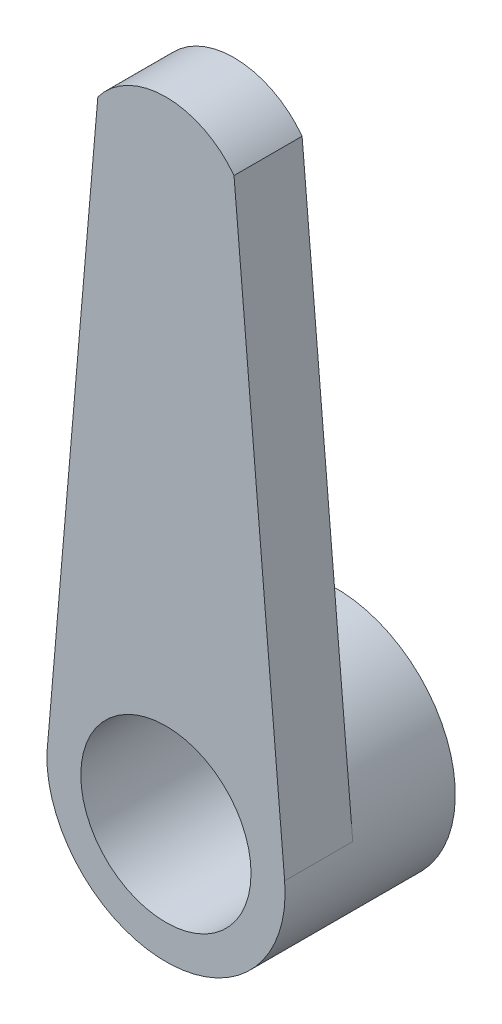
ISO-10303-21;
HEADER;
FILE_DESCRIPTION(('STEP AP214'),'2;1');
FILE_NAME('part.step','',(''),(''),'','','');
FILE_SCHEMA(('AUTOMOTIVE_DESIGN { 1 0 10303 214 1 1 1 1 }'));
ENDSEC;
DATA;
#1=APPLICATION_CONTEXT('core data for automotive mechanical design processes');
#2=APPLICATION_PROTOCOL_DEFINITION('international standard','automotive_design',2000,#1);
#3=PRODUCT_CONTEXT('',#1,'mechanical');
#4=PRODUCT('Part','Part','',(#3));
#5=PRODUCT_RELATED_PRODUCT_CATEGORY('part','',(#4));
#6=PRODUCT_DEFINITION_FORMATION('','',#4);
#7=PRODUCT_DEFINITION_CONTEXT('part definition',#1,'design');
#8=PRODUCT_DEFINITION('design','',#6,#7);
#9=PRODUCT_DEFINITION_SHAPE('','',#8);
#10=(LENGTH_UNIT() NAMED_UNIT(*) SI_UNIT(.MILLI.,.METRE.));
#11=(NAMED_UNIT(*) PLANE_ANGLE_UNIT() SI_UNIT($,.RADIAN.));
#12=(NAMED_UNIT(*) SI_UNIT($,.STERADIAN.) SOLID_ANGLE_UNIT());
#13=UNCERTAINTY_MEASURE_WITH_UNIT(LENGTH_MEASURE(1.E-05),#10,'distance_accuracy_value','');
#14=(GEOMETRIC_REPRESENTATION_CONTEXT(3) GLOBAL_UNCERTAINTY_ASSIGNED_CONTEXT((#13)) GLOBAL_UNIT_ASSIGNED_CONTEXT((#10,
#11,#12)) REPRESENTATION_CONTEXT('',''));
#15=CARTESIAN_POINT('',(0.,0.,0.));
#16=DIRECTION('',(0.,0.,1.));
#17=DIRECTION('',(1.,0.,0.));
#18=AXIS2_PLACEMENT_3D('',#15,#16,#17);
#19=CARTESIAN_POINT('',(0.,16.,0.));
#20=DIRECTION('',(0.,0.,-1.));
#21=DIRECTION('',(-1.,0.,0.));
#22=AXIS2_PLACEMENT_3D('',#19,#20,#21);
#23=CYLINDRICAL_SURFACE('',#22,2.5);
#24=CARTESIAN_POINT('',(0.,16.,-2.));
#25=DIRECTION('',(0.,0.,-1.));
#26=DIRECTION('',(-1.,0.,0.));
#27=AXIS2_PLACEMENT_3D('',#24,#25,#26);
#28=CIRCLE('',#27,2.5);
#29=CARTESIAN_POINT('',(-2.,17.5,-2.));
#30=VERTEX_POINT('',#29);
#31=CARTESIAN_POINT('',(2.,17.5,-2.));
#32=VERTEX_POINT('',#31);
#33=EDGE_CURVE('E132',#30,#32,#28,.T.);
#34=ORIENTED_EDGE('',*,*,#33,.F.);
#35=DIRECTION('',(0.,0.,-1.));
#36=VECTOR('',#35,1.);
#37=CARTESIAN_POINT('',(-2.,17.5,0.));
#38=LINE('',#37,#36);
#39=CARTESIAN_POINT('',(-2.,17.5,0.));
#40=VERTEX_POINT('',#39);
#41=EDGE_CURVE('E11',#40,#30,#38,.T.);
#42=ORIENTED_EDGE('',*,*,#41,.F.);
#43=CARTESIAN_POINT('',(0.,16.,0.));
#44=DIRECTION('',(0.,0.,-1.));
#45=DIRECTION('',(-1.,0.,0.));
#46=AXIS2_PLACEMENT_3D('',#43,#44,#45);
#47=CIRCLE('',#46,2.5);
#48=CARTESIAN_POINT('',(2.,17.5,0.));
#49=VERTEX_POINT('',#48);
#50=EDGE_CURVE('E133',#40,#49,#47,.T.);
#51=ORIENTED_EDGE('',*,*,#50,.T.);
#52=DIRECTION('',(0.,0.,-1.));
#53=VECTOR('',#52,1.);
#54=CARTESIAN_POINT('',(2.,17.5,0.));
#55=LINE('',#54,#53);
#56=EDGE_CURVE('E48',#49,#32,#55,.T.);
#57=ORIENTED_EDGE('',*,*,#56,.T.);
#58=EDGE_LOOP('',(#34,#42,#51,#57));
#59=FACE_BOUND('',#58,.T.);
#60=ADVANCED_FACE('F45',(#59),#23,.T.);
#61=CARTESIAN_POINT('',(-3.5,0.,0.));
#62=DIRECTION('',(-0.996346649041751,0.0854011413464358,0.));
#63=DIRECTION('',(-0.0854011413464358,-0.996346649041751,0.));
#64=AXIS2_PLACEMENT_3D('',#61,#62,#63);
#65=PLANE('',#64);
#66=DIRECTION('',(0.0854011413464358,0.996346649041751,0.));
#67=VECTOR('',#66,1.);
#68=CARTESIAN_POINT('',(-3.5,0.,-2.));
#69=LINE('',#68,#67);
#70=CARTESIAN_POINT('',(-3.44894651539708,0.595623987034039,-2.));
#71=VERTEX_POINT('',#70);
#72=EDGE_CURVE('E85',#71,#30,#69,.T.);
#73=ORIENTED_EDGE('',*,*,#72,.F.);
#74=DIRECTION('',(0.,0.,1.));
#75=VECTOR('',#74,1.);
#76=CARTESIAN_POINT('',(-3.44894651539708,0.59562398703403,-5.));
#77=LINE('',#76,#75);
#78=CARTESIAN_POINT('',(-3.44894651539708,0.59562398703403,-5.));
#79=VERTEX_POINT('',#78);
#80=EDGE_CURVE('E117',#79,#71,#77,.T.);
#81=ORIENTED_EDGE('',*,*,#80,.F.);
#82=DIRECTION('',(0.0854011413464338,0.996346649041751,0.));
#83=VECTOR('',#82,1.);
#84=CARTESIAN_POINT('',(-3.44894651539708,0.59562398703403,-5.));
#85=LINE('',#84,#83);
#86=CARTESIAN_POINT('',(-3.5,0.,-5.));
#87=VERTEX_POINT('',#86);
#88=EDGE_CURVE('E115',#87,#79,#85,.T.);
#89=ORIENTED_EDGE('',*,*,#88,.F.);
#90=DIRECTION('',(0.,0.,-1.));
#91=VECTOR('',#90,1.);
#92=CARTESIAN_POINT('',(-3.5,0.,0.));
#93=LINE('',#92,#91);
#94=CARTESIAN_POINT('',(-3.5,0.,0.));
#95=VERTEX_POINT('',#94);
#96=EDGE_CURVE('E54',#95,#87,#93,.T.);
#97=ORIENTED_EDGE('',*,*,#96,.F.);
#98=DIRECTION('',(0.0854011413464358,0.996346649041751,0.));
#99=VECTOR('',#98,1.);
#100=CARTESIAN_POINT('',(-3.5,0.,0.));
#101=LINE('',#100,#99);
#102=EDGE_CURVE('E141',#95,#40,#101,.T.);
#103=ORIENTED_EDGE('',*,*,#102,.T.);
#104=ORIENTED_EDGE('',*,*,#41,.T.);
#105=EDGE_LOOP('',(#73,#81,#89,#97,#103,#104));
#106=FACE_BOUND('',#105,.T.);
#107=ADVANCED_FACE('F116',(#106),#65,.T.);
#108=CARTESIAN_POINT('',(0.,0.,0.));
#109=DIRECTION('',(0.,0.,-1.));
#110=DIRECTION('',(-1.,0.,0.));
#111=AXIS2_PLACEMENT_3D('',#108,#109,#110);
#112=CYLINDRICAL_SURFACE('',#111,3.5);
#113=ORIENTED_EDGE('',*,*,#96,.T.);
#114=CARTESIAN_POINT('',(0.,0.,-5.));
#115=DIRECTION('',(0.,0.,-1.));
#116=DIRECTION('',(1.,0.,0.));
#117=AXIS2_PLACEMENT_3D('',#114,#115,#116);
#118=CIRCLE('',#117,3.5);
#119=EDGE_CURVE('E105',#79,#87,#118,.T.);
#120=ORIENTED_EDGE('',*,*,#119,.F.);
#121=ORIENTED_EDGE('',*,*,#80,.T.);
#122=CARTESIAN_POINT('',(0.,0.,-2.));
#123=DIRECTION('',(0.,0.,-1.));
#124=DIRECTION('',(1.,0.,0.));
#125=AXIS2_PLACEMENT_3D('',#122,#123,#124);
#126=CIRCLE('',#125,3.5);
#127=CARTESIAN_POINT('',(3.48699092900875,0.301486750970429,-2.));
#128=VERTEX_POINT('',#127);
#129=EDGE_CURVE('E62',#71,#128,#126,.T.);
#130=ORIENTED_EDGE('',*,*,#129,.T.);
#131=DIRECTION('',(0.,0.,-1.));
#132=VECTOR('',#131,1.);
#133=CARTESIAN_POINT('',(3.48699092900875,0.301486750970429,0.));
#134=LINE('',#133,#132);
#135=CARTESIAN_POINT('',(3.48699092900875,0.301486750970429,0.));
#136=VERTEX_POINT('',#135);
#137=EDGE_CURVE('E112',#136,#128,#134,.T.);
#138=ORIENTED_EDGE('',*,*,#137,.F.);
#139=CARTESIAN_POINT('',(0.,0.,0.));
#140=DIRECTION('',(0.,0.,-1.));
#141=DIRECTION('',(-1.,0.,0.));
#142=AXIS2_PLACEMENT_3D('',#139,#140,#141);
#143=CIRCLE('',#142,3.5);
#144=EDGE_CURVE('E107',#136,#95,#143,.T.);
#145=ORIENTED_EDGE('',*,*,#144,.T.);
#146=EDGE_LOOP('',(#113,#120,#121,#130,#138,#145));
#147=FACE_BOUND('',#146,.T.);
#148=ADVANCED_FACE('F102',(#147),#112,.T.);
#149=CARTESIAN_POINT('',(2.,17.5,0.));
#150=DIRECTION('',(0.996283122573928,0.0861390717058368,0.));
#151=DIRECTION('',(-0.0861390717058368,0.996283122573928,0.));
#152=AXIS2_PLACEMENT_3D('',#149,#150,#151);
#153=PLANE('',#152);
#154=DIRECTION('',(0.0861390717058368,-0.996283122573928,0.));
#155=VECTOR('',#154,1.);
#156=CARTESIAN_POINT('',(2.,17.5,-2.));
#157=LINE('',#156,#155);
#158=EDGE_CURVE('E146',#32,#128,#157,.T.);
#159=ORIENTED_EDGE('',*,*,#158,.F.);
#160=ORIENTED_EDGE('',*,*,#56,.F.);
#161=DIRECTION('',(0.0861390717058368,-0.996283122573928,0.));
#162=VECTOR('',#161,1.);
#163=CARTESIAN_POINT('',(2.,17.5,0.));
#164=LINE('',#163,#162);
#165=EDGE_CURVE('E136',#49,#136,#164,.T.);
#166=ORIENTED_EDGE('',*,*,#165,.T.);
#167=ORIENTED_EDGE('',*,*,#137,.T.);
#168=EDGE_LOOP('',(#159,#160,#166,#167));
#169=FACE_BOUND('',#168,.T.);
#170=ADVANCED_FACE('F152',(#169),#153,.T.);
#171=CARTESIAN_POINT('',(0.,16.,0.));
#172=DIRECTION('',(0.,0.,-1.));
#173=DIRECTION('',(-1.,0.,0.));
#174=AXIS2_PLACEMENT_3D('',#171,#172,#173);
#175=PLANE('',#174);
#176=CARTESIAN_POINT('',(0.,0.,0.));
#177=DIRECTION('',(0.,0.,-1.));
#178=DIRECTION('',(-1.,0.,0.));
#179=AXIS2_PLACEMENT_3D('',#176,#177,#178);
#180=CIRCLE('',#179,2.49999999999999);
#181=CARTESIAN_POINT('',(-2.49999999999999,0.,0.));
#182=VERTEX_POINT('',#181);
#183=EDGE_CURVE('E125',#182,#182,#180,.T.);
#184=ORIENTED_EDGE('',*,*,#183,.T.);
#185=EDGE_LOOP('',(#184));
#186=FACE_BOUND('',#185,.T.);
#187=ORIENTED_EDGE('',*,*,#50,.F.);
#188=ORIENTED_EDGE('',*,*,#102,.F.);
#189=ORIENTED_EDGE('',*,*,#144,.F.);
#190=ORIENTED_EDGE('',*,*,#165,.F.);
#191=EDGE_LOOP('',(#187,#188,#189,#190));
#192=FACE_BOUND('',#191,.T.);
#193=ADVANCED_FACE('F155',(#186,#192),#175,.F.);
#194=CARTESIAN_POINT('',(0.,16.,-2.));
#195=DIRECTION('',(0.,0.,-1.));
#196=DIRECTION('',(-1.,0.,0.));
#197=AXIS2_PLACEMENT_3D('',#194,#195,#196);
#198=PLANE('',#197);
#199=ORIENTED_EDGE('',*,*,#129,.F.);
#200=ORIENTED_EDGE('',*,*,#72,.T.);
#201=ORIENTED_EDGE('',*,*,#33,.T.);
#202=ORIENTED_EDGE('',*,*,#158,.T.);
#203=EDGE_LOOP('',(#199,#200,#201,#202));
#204=FACE_BOUND('',#203,.T.);
#205=ADVANCED_FACE('F153',(#204),#198,.T.);
#206=CARTESIAN_POINT('',(0.,0.,-5.));
#207=DIRECTION('',(0.,0.,1.));
#208=DIRECTION('',(1.,0.,0.));
#209=AXIS2_PLACEMENT_3D('',#206,#207,#208);
#210=PLANE('',#209);
#211=CARTESIAN_POINT('',(0.,0.,-5.));
#212=DIRECTION('',(0.,0.,-1.));
#213=DIRECTION('',(-1.,0.,0.));
#214=AXIS2_PLACEMENT_3D('',#211,#212,#213);
#215=CIRCLE('',#214,2.49999999999999);
#216=CARTESIAN_POINT('',(-2.49999999999999,0.,-5.));
#217=VERTEX_POINT('',#216);
#218=EDGE_CURVE('E214',#217,#217,#215,.T.);
#219=ORIENTED_EDGE('',*,*,#218,.F.);
#220=EDGE_LOOP('',(#219));
#221=FACE_BOUND('',#220,.T.);
#222=ORIENTED_EDGE('',*,*,#119,.T.);
#223=ORIENTED_EDGE('',*,*,#88,.T.);
#224=EDGE_LOOP('',(#222,#223));
#225=FACE_BOUND('',#224,.T.);
#226=ADVANCED_FACE('F121',(#221,#225),#210,.F.);
#227=CARTESIAN_POINT('',(0.,0.,-5.));
#228=DIRECTION('',(0.,0.,-1.));
#229=DIRECTION('',(-1.,0.,0.));
#230=AXIS2_PLACEMENT_3D('',#227,#228,#229);
#231=CYLINDRICAL_SURFACE('',#230,2.49999999999999);
#232=ORIENTED_EDGE('',*,*,#183,.F.);
#233=EDGE_LOOP('',(#232));
#234=FACE_BOUND('',#233,.T.);
#235=ORIENTED_EDGE('',*,*,#218,.T.);
#236=EDGE_LOOP('',(#235));
#237=FACE_BOUND('',#236,.T.);
#238=ADVANCED_FACE('F162',(#234,#237),#231,.F.);
#239=CLOSED_SHELL('',(#60,#107,#148,#170,#193,#205,#226,#238));
#240=MANIFOLD_SOLID_BREP('B2',#239);
#241=ADVANCED_BREP_SHAPE_REPRESENTATION('',(#18,#240),#14);
#242=SHAPE_DEFINITION_REPRESENTATION(#9,#241);
ENDSEC;
END-ISO-10303-21;
